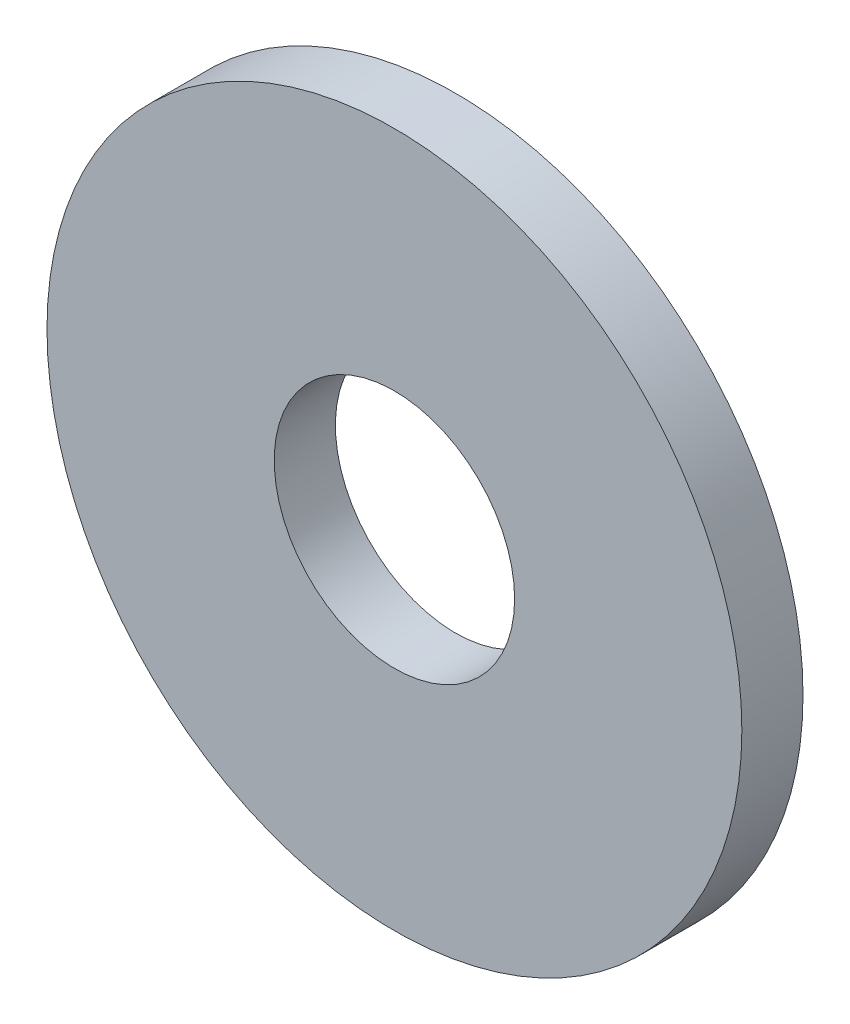
ISO-10303-21;
HEADER;
FILE_DESCRIPTION(('STEP AP214'),'2;1');
FILE_NAME('part.step','',(''),(''),'','','');
FILE_SCHEMA(('AUTOMOTIVE_DESIGN { 1 0 10303 214 1 1 1 1 }'));
ENDSEC;
DATA;
#1=APPLICATION_CONTEXT('core data for automotive mechanical design processes');
#2=APPLICATION_PROTOCOL_DEFINITION('international standard','automotive_design',2000,#1);
#3=PRODUCT_CONTEXT('',#1,'mechanical');
#4=PRODUCT('Part','Part','',(#3));
#5=PRODUCT_RELATED_PRODUCT_CATEGORY('part','',(#4));
#6=PRODUCT_DEFINITION_FORMATION('','',#4);
#7=PRODUCT_DEFINITION_CONTEXT('part definition',#1,'design');
#8=PRODUCT_DEFINITION('design','',#6,#7);
#9=PRODUCT_DEFINITION_SHAPE('','',#8);
#10=(LENGTH_UNIT() NAMED_UNIT(*) SI_UNIT(.MILLI.,.METRE.));
#11=(NAMED_UNIT(*) PLANE_ANGLE_UNIT() SI_UNIT($,.RADIAN.));
#12=(NAMED_UNIT(*) SI_UNIT($,.STERADIAN.) SOLID_ANGLE_UNIT());
#13=UNCERTAINTY_MEASURE_WITH_UNIT(LENGTH_MEASURE(1.E-05),#10,'distance_accuracy_value','');
#14=(GEOMETRIC_REPRESENTATION_CONTEXT(3) GLOBAL_UNCERTAINTY_ASSIGNED_CONTEXT((#13)) GLOBAL_UNIT_ASSIGNED_CONTEXT((#10,
#11,#12)) REPRESENTATION_CONTEXT('',''));
#15=CARTESIAN_POINT('',(0.,0.,0.));
#16=DIRECTION('',(0.,0.,1.));
#17=DIRECTION('',(1.,0.,0.));
#18=AXIS2_PLACEMENT_3D('',#15,#16,#17);
#19=CARTESIAN_POINT('',(0.,0.,5.588));
#20=DIRECTION('',(0.,0.,1.));
#21=DIRECTION('',(1.,0.,0.));
#22=AXIS2_PLACEMENT_3D('',#19,#20,#21);
#23=PLANE('',#22);
#24=CARTESIAN_POINT('',(0.,0.,5.588));
#25=DIRECTION('',(0.,0.,1.));
#26=DIRECTION('',(1.,0.,0.));
#27=AXIS2_PLACEMENT_3D('',#24,#25,#26);
#28=CIRCLE('',#27,31.75);
#29=CARTESIAN_POINT('',(31.75,0.,5.588));
#30=VERTEX_POINT('',#29);
#31=EDGE_CURVE('E10',#30,#30,#28,.T.);
#32=ORIENTED_EDGE('',*,*,#31,.T.);
#33=EDGE_LOOP('',(#32));
#34=FACE_BOUND('',#33,.T.);
#35=CARTESIAN_POINT('',(0.,0.,5.588));
#36=DIRECTION('',(0.,0.,1.));
#37=DIRECTION('',(1.,0.,0.));
#38=AXIS2_PLACEMENT_3D('',#35,#36,#37);
#39=CIRCLE('',#38,10.9855);
#40=CARTESIAN_POINT('',(10.9855,0.,5.588));
#41=VERTEX_POINT('',#40);
#42=EDGE_CURVE('E44',#41,#41,#39,.F.);
#43=ORIENTED_EDGE('',*,*,#42,.T.);
#44=EDGE_LOOP('',(#43));
#45=FACE_BOUND('',#44,.T.);
#46=ADVANCED_FACE('F33',(#34,#45),#23,.T.);
#47=CARTESIAN_POINT('',(0.,0.,0.));
#48=DIRECTION('',(0.,0.,1.));
#49=DIRECTION('',(1.,0.,0.));
#50=AXIS2_PLACEMENT_3D('',#47,#48,#49);
#51=PLANE('',#50);
#52=CARTESIAN_POINT('',(0.,0.,0.));
#53=DIRECTION('',(0.,0.,1.));
#54=DIRECTION('',(0.999050338022658,0.0435708858851052,0.));
#55=AXIS2_PLACEMENT_3D('',#52,#53,#54);
#56=CIRCLE('',#55,10.9855);
#57=CARTESIAN_POINT('',(10.9750674883479,0.47864796689082,0.));
#58=VERTEX_POINT('',#57);
#59=EDGE_CURVE('E48',#58,#58,#56,.T.);
#60=ORIENTED_EDGE('',*,*,#59,.T.);
#61=EDGE_LOOP('',(#60));
#62=FACE_BOUND('',#61,.T.);
#63=CARTESIAN_POINT('',(0.,0.,0.));
#64=DIRECTION('',(0.,0.,1.));
#65=DIRECTION('',(1.,0.,0.));
#66=AXIS2_PLACEMENT_3D('',#63,#64,#65);
#67=CIRCLE('',#66,31.75);
#68=CARTESIAN_POINT('',(31.75,0.,0.));
#69=VERTEX_POINT('',#68);
#70=EDGE_CURVE('E37',#69,#69,#67,.T.);
#71=ORIENTED_EDGE('',*,*,#70,.F.);
#72=EDGE_LOOP('',(#71));
#73=FACE_BOUND('',#72,.T.);
#74=ADVANCED_FACE('F52',(#62,#73),#51,.F.);
#75=CARTESIAN_POINT('',(0.,0.,5.588));
#76=DIRECTION('',(0.,0.,-1.));
#77=DIRECTION('',(-1.,0.,0.));
#78=AXIS2_PLACEMENT_3D('',#75,#76,#77);
#79=CYLINDRICAL_SURFACE('',#78,31.75);
#80=ORIENTED_EDGE('',*,*,#31,.F.);
#81=EDGE_LOOP('',(#80));
#82=FACE_BOUND('',#81,.T.);
#83=ORIENTED_EDGE('',*,*,#70,.T.);
#84=EDGE_LOOP('',(#83));
#85=FACE_BOUND('',#84,.T.);
#86=ADVANCED_FACE('F35',(#82,#85),#79,.T.);
#87=CARTESIAN_POINT('',(0.,0.,16.764));
#88=DIRECTION('',(0.,0.,-1.));
#89=DIRECTION('',(-0.999050338022658,-0.0435708858851052,0.));
#90=AXIS2_PLACEMENT_3D('',#87,#88,#89);
#91=CYLINDRICAL_SURFACE('',#90,10.9855);
#92=ORIENTED_EDGE('',*,*,#42,.F.);
#93=EDGE_LOOP('',(#92));
#94=FACE_BOUND('',#93,.T.);
#95=ORIENTED_EDGE('',*,*,#59,.F.);
#96=EDGE_LOOP('',(#95));
#97=FACE_BOUND('',#96,.T.);
#98=ADVANCED_FACE('F55',(#94,#97),#91,.F.);
#99=CLOSED_SHELL('',(#46,#74,#86,#98));
#100=MANIFOLD_SOLID_BREP('B2',#99);
#101=ADVANCED_BREP_SHAPE_REPRESENTATION('',(#18,#100),#14);
#102=SHAPE_DEFINITION_REPRESENTATION(#9,#101);
ENDSEC;
END-ISO-10303-21;
